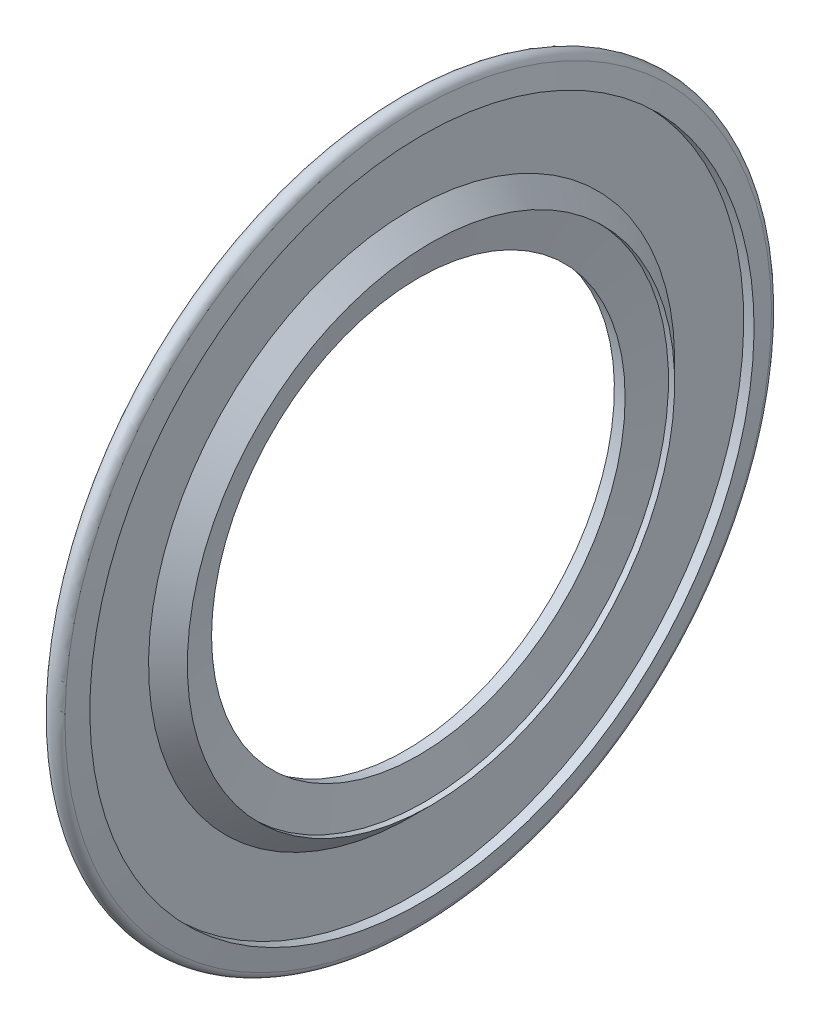
ISO-10303-21;
HEADER;
FILE_DESCRIPTION(('STEP AP214'),'2;1');
FILE_NAME('part.step','',(''),(''),'','','');
FILE_SCHEMA(('AUTOMOTIVE_DESIGN { 1 0 10303 214 1 1 1 1 }'));
ENDSEC;
DATA;
#1=APPLICATION_CONTEXT('core data for automotive mechanical design processes');
#2=APPLICATION_PROTOCOL_DEFINITION('international standard','automotive_design',2000,#1);
#3=PRODUCT_CONTEXT('',#1,'mechanical');
#4=PRODUCT('Part','Part','',(#3));
#5=PRODUCT_RELATED_PRODUCT_CATEGORY('part','',(#4));
#6=PRODUCT_DEFINITION_FORMATION('','',#4);
#7=PRODUCT_DEFINITION_CONTEXT('part definition',#1,'design');
#8=PRODUCT_DEFINITION('design','',#6,#7);
#9=PRODUCT_DEFINITION_SHAPE('','',#8);
#10=(LENGTH_UNIT() NAMED_UNIT(*) SI_UNIT(.MILLI.,.METRE.));
#11=(NAMED_UNIT(*) PLANE_ANGLE_UNIT() SI_UNIT($,.RADIAN.));
#12=(NAMED_UNIT(*) SI_UNIT($,.STERADIAN.) SOLID_ANGLE_UNIT());
#13=UNCERTAINTY_MEASURE_WITH_UNIT(LENGTH_MEASURE(1.E-05),#10,'distance_accuracy_value','');
#14=(GEOMETRIC_REPRESENTATION_CONTEXT(3) GLOBAL_UNCERTAINTY_ASSIGNED_CONTEXT((#13)) GLOBAL_UNIT_ASSIGNED_CONTEXT((#10,
#11,#12)) REPRESENTATION_CONTEXT('',''));
#15=CARTESIAN_POINT('',(0.,0.,0.));
#16=DIRECTION('',(0.,0.,1.));
#17=DIRECTION('',(1.,0.,0.));
#18=AXIS2_PLACEMENT_3D('',#15,#16,#17);
#19=CARTESIAN_POINT('',(0.5658,0.,0.));
#20=DIRECTION('',(-1.,0.,0.));
#21=DIRECTION('',(0.,1.,0.));
#22=AXIS2_PLACEMENT_3D('',#19,#20,#21);
#23=CONICAL_SURFACE('',#22,8.08786571622134,0.174532925199436);
#24=CARTESIAN_POINT('',(0.82,0.,0.));
#25=DIRECTION('',(1.,0.,0.));
#26=DIRECTION('',(0.,1.,0.));
#27=AXIS2_PLACEMENT_3D('',#24,#25,#26);
#28=CIRCLE('',#27,8.04304339772525);
#29=CARTESIAN_POINT('',(0.82,8.04304339772525,0.));
#30=VERTEX_POINT('',#29);
#31=EDGE_CURVE('E11',#30,#30,#28,.T.);
#32=ORIENTED_EDGE('',*,*,#31,.T.);
#33=EDGE_LOOP('',(#32));
#34=FACE_BOUND('',#33,.T.);
#35=CARTESIAN_POINT('',(0.3116,0.,0.));
#36=DIRECTION('',(1.,0.,0.));
#37=DIRECTION('',(0.,1.,0.));
#38=AXIS2_PLACEMENT_3D('',#35,#36,#37);
#39=CIRCLE('',#38,8.13268803471743);
#40=CARTESIAN_POINT('',(0.3116,8.13268803471743,0.));
#41=VERTEX_POINT('',#40);
#42=EDGE_CURVE('E70',#41,#41,#39,.T.);
#43=ORIENTED_EDGE('',*,*,#42,.F.);
#44=EDGE_LOOP('',(#43));
#45=FACE_BOUND('',#44,.T.);
#46=ADVANCED_FACE('F17',(#34,#45),#23,.F.);
#47=CARTESIAN_POINT('',(0.946422619073039,0.,0.));
#48=DIRECTION('',(1.,0.,0.));
#49=DIRECTION('',(0.,1.,0.));
#50=AXIS2_PLACEMENT_3D('',#47,#48,#49);
#51=CONICAL_SURFACE('',#50,8.76002169886262,1.39626340159546);
#52=CARTESIAN_POINT('',(1.07284523814608,0.,0.));
#53=DIRECTION('',(1.,0.,0.));
#54=DIRECTION('',(0.,1.,0.));
#55=AXIS2_PLACEMENT_3D('',#52,#53,#54);
#56=CIRCLE('',#55,9.477);
#57=CARTESIAN_POINT('',(1.07284523814608,9.477,0.));
#58=VERTEX_POINT('',#57);
#59=EDGE_CURVE('E26',#58,#58,#56,.T.);
#60=ORIENTED_EDGE('',*,*,#59,.T.);
#61=EDGE_LOOP('',(#60));
#62=FACE_BOUND('',#61,.T.);
#63=ORIENTED_EDGE('',*,*,#31,.F.);
#64=EDGE_LOOP('',(#63));
#65=FACE_BOUND('',#64,.T.);
#66=ADVANCED_FACE('F119',(#62,#65),#51,.F.);
#67=CARTESIAN_POINT('',(1.19242261907304,0.,0.));
#68=DIRECTION('',(-1.,0.,0.));
#69=DIRECTION('',(0.,1.,0.));
#70=AXIS2_PLACEMENT_3D('',#67,#68,#69);
#71=CYLINDRICAL_SURFACE('',#70,9.477);
#72=CARTESIAN_POINT('',(1.312,0.,0.));
#73=DIRECTION('',(1.,0.,0.));
#74=DIRECTION('',(0.,1.,0.));
#75=AXIS2_PLACEMENT_3D('',#72,#73,#74);
#76=CIRCLE('',#75,9.477);
#77=CARTESIAN_POINT('',(1.312,9.477,0.));
#78=VERTEX_POINT('',#77);
#79=EDGE_CURVE('E54',#78,#78,#76,.T.);
#80=ORIENTED_EDGE('',*,*,#79,.T.);
#81=EDGE_LOOP('',(#80));
#82=FACE_BOUND('',#81,.T.);
#83=ORIENTED_EDGE('',*,*,#59,.F.);
#84=EDGE_LOOP('',(#83));
#85=FACE_BOUND('',#84,.T.);
#86=ADVANCED_FACE('F123',(#82,#85),#71,.F.);
#87=CARTESIAN_POINT('',(0.9348,0.,0.));
#88=DIRECTION('',(-1.,0.,0.));
#89=DIRECTION('',(0.,1.,0.));
#90=AXIS2_PLACEMENT_3D('',#87,#88,#89);
#91=CONICAL_SURFACE('',#90,9.8542,0.785398163397449);
#92=CARTESIAN_POINT('',(0.5576,0.,0.));
#93=DIRECTION('',(1.,0.,0.));
#94=DIRECTION('',(0.,1.,0.));
#95=AXIS2_PLACEMENT_3D('',#92,#93,#94);
#96=CIRCLE('',#95,10.2314);
#97=CARTESIAN_POINT('',(0.5576,10.2314,0.));
#98=VERTEX_POINT('',#97);
#99=EDGE_CURVE('E59',#98,#98,#96,.T.);
#100=ORIENTED_EDGE('',*,*,#99,.T.);
#101=EDGE_LOOP('',(#100));
#102=FACE_BOUND('',#101,.T.);
#103=ORIENTED_EDGE('',*,*,#79,.F.);
#104=EDGE_LOOP('',(#103));
#105=FACE_BOUND('',#104,.T.);
#106=ADVANCED_FACE('F114',(#102,#105),#91,.T.);
#107=CARTESIAN_POINT('',(0.5576,11.57443,0.));
#108=DIRECTION('',(1.,0.,0.));
#109=DIRECTION('',(0.,1.,0.));
#110=AXIS2_PLACEMENT_3D('',#107,#108,#109);
#111=PLANE('',#110);
#112=CARTESIAN_POINT('',(0.5576,0.,0.));
#113=DIRECTION('',(1.,0.,0.));
#114=DIRECTION('',(0.,1.,0.));
#115=AXIS2_PLACEMENT_3D('',#112,#113,#114);
#116=CIRCLE('',#115,12.91746);
#117=CARTESIAN_POINT('',(0.5576,12.91746,0.));
#118=VERTEX_POINT('',#117);
#119=EDGE_CURVE('E94',#118,#118,#116,.T.);
#120=ORIENTED_EDGE('',*,*,#119,.T.);
#121=EDGE_LOOP('',(#120));
#122=FACE_BOUND('',#121,.T.);
#123=ORIENTED_EDGE('',*,*,#99,.F.);
#124=EDGE_LOOP('',(#123));
#125=FACE_BOUND('',#124,.T.);
#126=ADVANCED_FACE('F99',(#122,#125),#111,.T.);
#127=CARTESIAN_POINT('',(0.758881712293579,0.,0.));
#128=DIRECTION('',(-1.,0.,0.));
#129=DIRECTION('',(0.,1.,0.));
#130=AXIS2_PLACEMENT_3D('',#127,#128,#129);
#131=CYLINDRICAL_SURFACE('',#130,12.91746);
#132=CARTESIAN_POINT('',(0.960163424587157,0.,0.));
#133=DIRECTION('',(1.,0.,0.));
#134=DIRECTION('',(0.,1.,0.));
#135=AXIS2_PLACEMENT_3D('',#132,#133,#134);
#136=CIRCLE('',#135,12.91746);
#137=CARTESIAN_POINT('',(0.960163424587157,12.91746,0.));
#138=VERTEX_POINT('',#137);
#139=EDGE_CURVE('E20',#138,#138,#136,.T.);
#140=ORIENTED_EDGE('',*,*,#139,.T.);
#141=EDGE_LOOP('',(#140));
#142=FACE_BOUND('',#141,.T.);
#143=ORIENTED_EDGE('',*,*,#119,.F.);
#144=EDGE_LOOP('',(#143));
#145=FACE_BOUND('',#144,.T.);
#146=ADVANCED_FACE('F102',(#142,#145),#131,.F.);
#147=CARTESIAN_POINT('',(0.887590183787581,0.,0.));
#148=DIRECTION('',(-1.,0.,0.));
#149=DIRECTION('',(0.,1.,0.));
#150=AXIS2_PLACEMENT_3D('',#147,#148,#149);
#151=CONICAL_SURFACE('',#150,13.3290433011374,1.39626340159546);
#152=CARTESIAN_POINT('',(0.815016942988005,0.,0.));
#153=DIRECTION('',(1.,0.,0.));
#154=DIRECTION('',(0.,1.,0.));
#155=AXIS2_PLACEMENT_3D('',#152,#153,#154);
#156=CIRCLE('',#155,13.7406266022747);
#157=CARTESIAN_POINT('',(0.815016942988005,13.7406266022747,0.));
#158=VERTEX_POINT('',#157);
#159=EDGE_CURVE('E86',#158,#158,#156,.T.);
#160=ORIENTED_EDGE('',*,*,#159,.T.);
#161=EDGE_LOOP('',(#160));
#162=FACE_BOUND('',#161,.T.);
#163=ORIENTED_EDGE('',*,*,#139,.F.);
#164=EDGE_LOOP('',(#163));
#165=FACE_BOUND('',#164,.T.);
#166=ADVANCED_FACE('F104',(#162,#165),#151,.T.);
#167=CARTESIAN_POINT('',(0.492,0.,0.));
#168=DIRECTION('',(1.,0.,0.));
#169=DIRECTION('',(0.,0.,-1.));
#170=AXIS2_PLACEMENT_3D('',#167,#168,#169);
#171=TOROIDAL_SURFACE('',#170,13.68367,0.328);
#172=CARTESIAN_POINT('',(0.207943667558704,0.,0.));
#173=DIRECTION('',(1.,0.,0.));
#174=DIRECTION('',(0.,1.,0.));
#175=AXIS2_PLACEMENT_3D('',#172,#173,#174);
#176=CIRCLE('',#175,13.84767);
#177=CARTESIAN_POINT('',(0.207943667558704,13.84767,0.));
#178=VERTEX_POINT('',#177);
#179=EDGE_CURVE('E85',#178,#178,#176,.T.);
#180=ORIENTED_EDGE('',*,*,#179,.T.);
#181=EDGE_LOOP('',(#180));
#182=FACE_BOUND('',#181,.T.);
#183=ORIENTED_EDGE('',*,*,#159,.F.);
#184=EDGE_LOOP('',(#183));
#185=FACE_BOUND('',#184,.T.);
#186=ADVANCED_FACE('F112',(#182,#185),#171,.T.);
#187=CARTESIAN_POINT('',(0.207943667558704,13.58527,0.));
#188=DIRECTION('',(-1.,0.,0.));
#189=DIRECTION('',(0.,-1.,0.));
#190=AXIS2_PLACEMENT_3D('',#187,#188,#189);
#191=PLANE('',#190);
#192=CARTESIAN_POINT('',(0.207943667558704,0.,0.));
#193=DIRECTION('',(1.,0.,0.));
#194=DIRECTION('',(0.,1.,0.));
#195=AXIS2_PLACEMENT_3D('',#192,#193,#194);
#196=CIRCLE('',#195,13.32287);
#197=CARTESIAN_POINT('',(0.207943667558704,13.32287,0.));
#198=VERTEX_POINT('',#197);
#199=EDGE_CURVE('E83',#198,#198,#196,.T.);
#200=ORIENTED_EDGE('',*,*,#199,.T.);
#201=EDGE_LOOP('',(#200));
#202=FACE_BOUND('',#201,.T.);
#203=ORIENTED_EDGE('',*,*,#179,.F.);
#204=EDGE_LOOP('',(#203));
#205=FACE_BOUND('',#204,.T.);
#206=ADVANCED_FACE('F131',(#202,#205),#191,.T.);
#207=CARTESIAN_POINT('',(0.136771833779352,0.,0.));
#208=DIRECTION('',(1.,0.,0.));
#209=DIRECTION('',(0.,1.,0.));
#210=AXIS2_PLACEMENT_3D('',#207,#208,#209);
#211=CONICAL_SURFACE('',#210,13.2516981662206,0.785398163397442);
#212=CARTESIAN_POINT('',(0.0656,0.,0.));
#213=DIRECTION('',(1.,0.,0.));
#214=DIRECTION('',(0.,1.,0.));
#215=AXIS2_PLACEMENT_3D('',#212,#213,#214);
#216=CIRCLE('',#215,13.1805263324413);
#217=CARTESIAN_POINT('',(0.0656,13.1805263324413,0.));
#218=VERTEX_POINT('',#217);
#219=EDGE_CURVE('E77',#218,#218,#216,.T.);
#220=ORIENTED_EDGE('',*,*,#219,.T.);
#221=EDGE_LOOP('',(#220));
#222=FACE_BOUND('',#221,.T.);
#223=ORIENTED_EDGE('',*,*,#199,.F.);
#224=EDGE_LOOP('',(#223));
#225=FACE_BOUND('',#224,.T.);
#226=ADVANCED_FACE('F175',(#222,#225),#211,.T.);
#227=CARTESIAN_POINT('',(0.0656,11.3287631662206,0.));
#228=DIRECTION('',(-1.,0.,0.));
#229=DIRECTION('',(0.,-1.,0.));
#230=AXIS2_PLACEMENT_3D('',#227,#228,#229);
#231=PLANE('',#230);
#232=CARTESIAN_POINT('',(0.0656,0.,0.));
#233=DIRECTION('',(1.,0.,0.));
#234=DIRECTION('',(0.,1.,0.));
#235=AXIS2_PLACEMENT_3D('',#232,#233,#234);
#236=CIRCLE('',#235,9.477);
#237=CARTESIAN_POINT('',(0.0656,9.477,0.));
#238=VERTEX_POINT('',#237);
#239=EDGE_CURVE('E74',#238,#238,#236,.T.);
#240=ORIENTED_EDGE('',*,*,#239,.T.);
#241=EDGE_LOOP('',(#240));
#242=FACE_BOUND('',#241,.T.);
#243=ORIENTED_EDGE('',*,*,#219,.F.);
#244=EDGE_LOOP('',(#243));
#245=FACE_BOUND('',#244,.T.);
#246=ADVANCED_FACE('F184',(#242,#245),#231,.T.);
#247=CARTESIAN_POINT('',(0.1886,0.,0.));
#248=DIRECTION('',(-1.,0.,0.));
#249=DIRECTION('',(0.,1.,0.));
#250=AXIS2_PLACEMENT_3D('',#247,#248,#249);
#251=CYLINDRICAL_SURFACE('',#250,9.477);
#252=CARTESIAN_POINT('',(0.3116,0.,0.));
#253=DIRECTION('',(1.,0.,0.));
#254=DIRECTION('',(0.,1.,0.));
#255=AXIS2_PLACEMENT_3D('',#252,#253,#254);
#256=CIRCLE('',#255,9.477);
#257=CARTESIAN_POINT('',(0.3116,9.477,0.));
#258=VERTEX_POINT('',#257);
#259=EDGE_CURVE('E75',#258,#258,#256,.T.);
#260=ORIENTED_EDGE('',*,*,#259,.T.);
#261=EDGE_LOOP('',(#260));
#262=FACE_BOUND('',#261,.T.);
#263=ORIENTED_EDGE('',*,*,#239,.F.);
#264=EDGE_LOOP('',(#263));
#265=FACE_BOUND('',#264,.T.);
#266=ADVANCED_FACE('F193',(#262,#265),#251,.F.);
#267=CARTESIAN_POINT('',(0.3116,8.80484401735872,0.));
#268=DIRECTION('',(-1.,0.,0.));
#269=DIRECTION('',(0.,-1.,0.));
#270=AXIS2_PLACEMENT_3D('',#267,#268,#269);
#271=PLANE('',#270);
#272=ORIENTED_EDGE('',*,*,#42,.T.);
#273=EDGE_LOOP('',(#272));
#274=FACE_BOUND('',#273,.T.);
#275=ORIENTED_EDGE('',*,*,#259,.F.);
#276=EDGE_LOOP('',(#275));
#277=FACE_BOUND('',#276,.T.);
#278=ADVANCED_FACE('F71',(#274,#277),#271,.T.);
#279=CLOSED_SHELL('',(#46,#66,#86,#106,#126,#146,#166,#186,#206,#226,#246,#266,#278));
#280=MANIFOLD_SOLID_BREP('B1',#279);
#281=ADVANCED_BREP_SHAPE_REPRESENTATION('',(#18,#280),#14);
#282=SHAPE_DEFINITION_REPRESENTATION(#9,#281);
ENDSEC;
END-ISO-10303-21;
